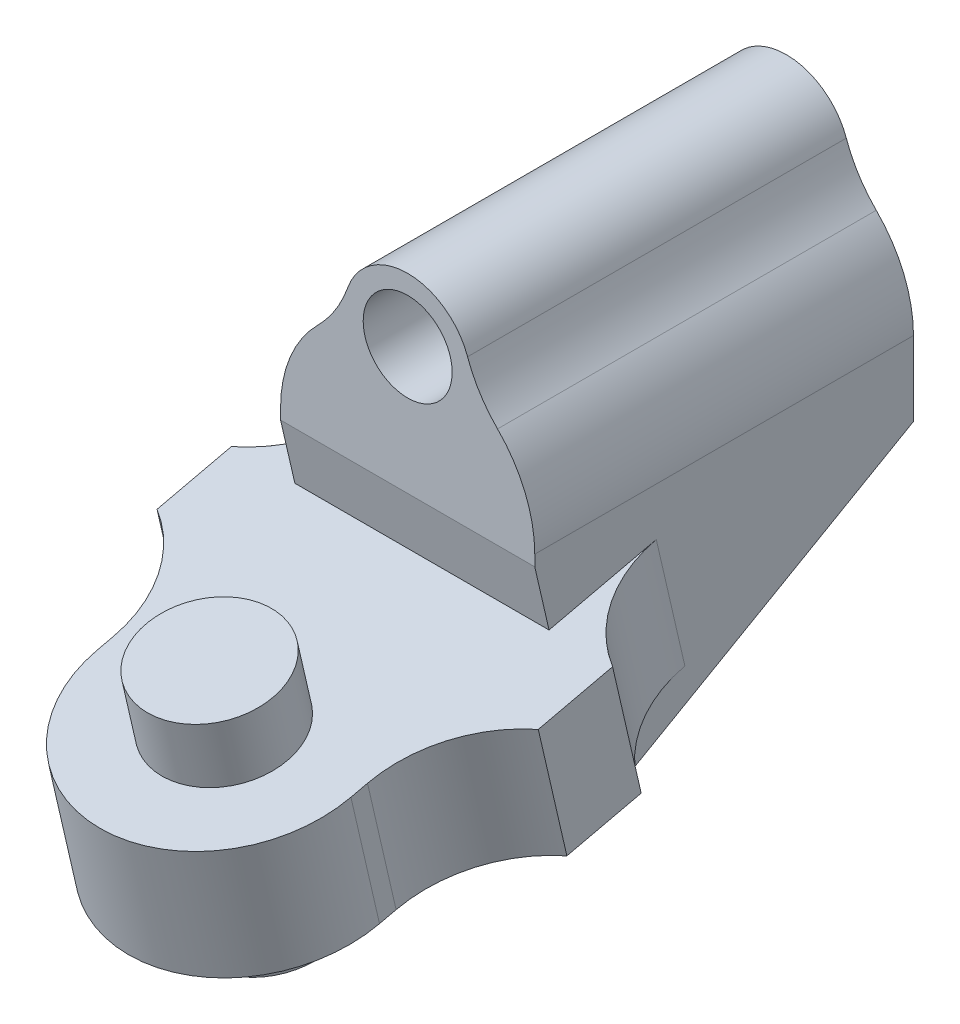
ISO-10303-21;
HEADER;
FILE_DESCRIPTION(('STEP AP214'),'2;1');
FILE_NAME('part.step','',(''),(''),'','','');
FILE_SCHEMA(('AUTOMOTIVE_DESIGN { 1 0 10303 214 1 1 1 1 }'));
ENDSEC;
DATA;
#1=APPLICATION_CONTEXT('core data for automotive mechanical design processes');
#2=APPLICATION_PROTOCOL_DEFINITION('international standard','automotive_design',2000,#1);
#3=PRODUCT_CONTEXT('',#1,'mechanical');
#4=PRODUCT('Part','Part','',(#3));
#5=PRODUCT_RELATED_PRODUCT_CATEGORY('part','',(#4));
#6=PRODUCT_DEFINITION_FORMATION('','',#4);
#7=PRODUCT_DEFINITION_CONTEXT('part definition',#1,'design');
#8=PRODUCT_DEFINITION('design','',#6,#7);
#9=PRODUCT_DEFINITION_SHAPE('','',#8);
#10=(LENGTH_UNIT() NAMED_UNIT(*) SI_UNIT(.MILLI.,.METRE.));
#11=(NAMED_UNIT(*) PLANE_ANGLE_UNIT() SI_UNIT($,.RADIAN.));
#12=(NAMED_UNIT(*) SI_UNIT($,.STERADIAN.) SOLID_ANGLE_UNIT());
#13=UNCERTAINTY_MEASURE_WITH_UNIT(LENGTH_MEASURE(1.E-05),#10,'distance_accuracy_value','');
#14=(GEOMETRIC_REPRESENTATION_CONTEXT(3) GLOBAL_UNCERTAINTY_ASSIGNED_CONTEXT((#13)) GLOBAL_UNIT_ASSIGNED_CONTEXT((#10,
#11,#12)) REPRESENTATION_CONTEXT('',''));
#15=CARTESIAN_POINT('',(0.,0.,0.));
#16=DIRECTION('',(0.,0.,1.));
#17=DIRECTION('',(1.,0.,0.));
#18=AXIS2_PLACEMENT_3D('',#15,#16,#17);
#19=CARTESIAN_POINT('',(0.,-2.5,14.9));
#20=DIRECTION('',(1.,0.,0.));
#21=DIRECTION('',(0.,0.,-1.));
#22=AXIS2_PLACEMENT_3D('',#19,#20,#21);
#23=PLANE('',#22);
#24=DIRECTION('',(0.,-0.224951054343865,0.974370064785235));
#25=VECTOR('',#24,1.);
#26=CARTESIAN_POINT('',(0.,-7.30941771983705,13.789658430654));
#27=LINE('',#26,#25);
#28=CARTESIAN_POINT('',(0.,-6.46185852361369,10.1184762201848));
#29=VERTEX_POINT('',#28);
#30=CARTESIAN_POINT('',(0.,-7.43592516196309,14.3376223641403));
#31=VERTEX_POINT('',#30);
#32=EDGE_CURVE('E201',#29,#31,#27,.T.);
#33=ORIENTED_EDGE('',*,*,#32,.T.);
#34=DIRECTION('',(0.,0.974370064785236,0.224951054343862));
#35=VECTOR('',#34,1.);
#36=CARTESIAN_POINT('',(0.,-5.,14.9));
#37=LINE('',#36,#35);
#38=CARTESIAN_POINT('',(0.,-5.,14.9));
#39=VERTEX_POINT('',#38);
#40=EDGE_CURVE('E77',#39,#31,#37,.F.);
#41=ORIENTED_EDGE('',*,*,#40,.F.);
#42=DIRECTION('',(0.,-1.,0.));
#43=VECTOR('',#42,1.);
#44=CARTESIAN_POINT('',(0.,-5.,14.9));
#45=LINE('',#44,#43);
#46=CARTESIAN_POINT('',(0.,-4.57106781186548,14.9));
#47=VERTEX_POINT('',#46);
#48=EDGE_CURVE('E556',#47,#39,#45,.T.);
#49=ORIENTED_EDGE('',*,*,#48,.F.);
#50=DIRECTION('',(0.,0.,-1.));
#51=VECTOR('',#50,1.);
#52=CARTESIAN_POINT('',(0.,-4.57106781186548,0.));
#53=LINE('',#52,#51);
#54=CARTESIAN_POINT('',(0.,-4.57106781186548,0.));
#55=VERTEX_POINT('',#54);
#56=EDGE_CURVE('E216',#47,#55,#53,.T.);
#57=ORIENTED_EDGE('',*,*,#56,.T.);
#58=DIRECTION('',(0.,-1.,0.));
#59=VECTOR('',#58,1.);
#60=CARTESIAN_POINT('',(0.,-2.5,0.));
#61=LINE('',#60,#59);
#62=CARTESIAN_POINT('',(0.,-7.5,0.));
#63=VERTEX_POINT('',#62);
#64=EDGE_CURVE('E292',#55,#63,#61,.T.);
#65=ORIENTED_EDGE('',*,*,#64,.T.);
#66=DIRECTION('',(0.,-0.49690665328333,0.867803997411144));
#67=VECTOR('',#66,1.);
#68=CARTESIAN_POINT('',(0.,-11.1218503239262,6.32524472828067));
#69=LINE('',#68,#67);
#70=CARTESIAN_POINT('',(0.,-14.7437006478523,12.6504894565614));
#71=VERTEX_POINT('',#70);
#72=EDGE_CURVE('E271',#63,#71,#69,.T.);
#73=ORIENTED_EDGE('',*,*,#72,.T.);
#74=DIRECTION('',(0.,-0.974370064785235,-0.224951054343865));
#75=VECTOR('',#74,1.);
#76=CARTESIAN_POINT('',(0.,-9.87185032392617,13.7752447282807));
#77=LINE('',#76,#75);
#78=CARTESIAN_POINT('',(0.,-12.3077754858893,13.212867092421));
#79=VERTEX_POINT('',#78);
#80=EDGE_CURVE('E66',#79,#71,#77,.T.);
#81=ORIENTED_EDGE('',*,*,#80,.F.);
#82=DIRECTION('',(0.,0.224951054343865,-0.974370064785235));
#83=VECTOR('',#82,1.);
#84=CARTESIAN_POINT('',(0.,-12.9826286489209,16.1359772867767));
#85=LINE('',#84,#83);
#86=CARTESIAN_POINT('',(0.,-11.3337088475399,8.9937209484655));
#87=VERTEX_POINT('',#86);
#88=EDGE_CURVE('E203',#79,#87,#85,.T.);
#89=ORIENTED_EDGE('',*,*,#88,.T.);
#90=DIRECTION('',(0.,0.974370064785235,0.224951054343865));
#91=VECTOR('',#90,1.);
#92=CARTESIAN_POINT('',(0.,-1.65244080377664,11.2288177895308));
#93=LINE('',#92,#91);
#94=EDGE_CURVE('E199',#87,#29,#93,.T.);
#95=ORIENTED_EDGE('',*,*,#94,.T.);
#96=EDGE_LOOP('',(#33,#41,#49,#57,#65,#73,#81,#89,#95));
#97=FACE_BOUND('',#96,.T.);
#98=ADVANCED_FACE('F48',(#97),#23,.F.);
#99=CARTESIAN_POINT('',(10.,-2.5,14.9));
#100=DIRECTION('',(1.,0.,0.));
#101=DIRECTION('',(0.,0.,-1.));
#102=AXIS2_PLACEMENT_3D('',#99,#100,#101);
#103=PLANE('',#102);
#104=DIRECTION('',(0.,0.,-1.));
#105=VECTOR('',#104,1.);
#106=CARTESIAN_POINT('',(10.,-4.57106781186548,14.9));
#107=LINE('',#106,#105);
#108=CARTESIAN_POINT('',(10.,-4.57106781186548,0.));
#109=VERTEX_POINT('',#108);
#110=CARTESIAN_POINT('',(10.,-4.57106781186548,14.9));
#111=VERTEX_POINT('',#110);
#112=EDGE_CURVE('E485',#109,#111,#107,.F.);
#113=ORIENTED_EDGE('',*,*,#112,.T.);
#114=DIRECTION('',(0.,1.,0.));
#115=VECTOR('',#114,1.);
#116=CARTESIAN_POINT('',(10.,-4.57106781186548,14.9));
#117=LINE('',#116,#115);
#118=CARTESIAN_POINT('',(10.,-5.,14.9));
#119=VERTEX_POINT('',#118);
#120=EDGE_CURVE('E549',#119,#111,#117,.T.);
#121=ORIENTED_EDGE('',*,*,#120,.F.);
#122=DIRECTION('',(0.,0.974370064785236,0.224951054343862));
#123=VECTOR('',#122,1.);
#124=CARTESIAN_POINT('',(10.,-5.,14.9));
#125=LINE('',#124,#123);
#126=CARTESIAN_POINT('',(10.,-7.43592516196309,14.3376223641403));
#127=VERTEX_POINT('',#126);
#128=EDGE_CURVE('E551',#119,#127,#125,.F.);
#129=ORIENTED_EDGE('',*,*,#128,.T.);
#130=DIRECTION('',(0.,0.224951054343865,-0.974370064785235));
#131=VECTOR('',#130,1.);
#132=CARTESIAN_POINT('',(10.,-8.11077832499468,17.260732558496));
#133=LINE('',#132,#131);
#134=CARTESIAN_POINT('',(10.,-6.46185852361368,10.1184762201848));
#135=VERTEX_POINT('',#134);
#136=EDGE_CURVE('E492',#127,#135,#133,.T.);
#137=ORIENTED_EDGE('',*,*,#136,.T.);
#138=DIRECTION('',(0.,-0.974370064785235,-0.224951054343865));
#139=VECTOR('',#138,1.);
#140=CARTESIAN_POINT('',(10.,-11.3337088475399,8.9937209484655));
#141=LINE('',#140,#139);
#142=CARTESIAN_POINT('',(10.,-11.3337088475399,8.9937209484655));
#143=VERTEX_POINT('',#142);
#144=EDGE_CURVE('E266',#135,#143,#141,.T.);
#145=ORIENTED_EDGE('',*,*,#144,.T.);
#146=DIRECTION('',(0.,-0.224951054343865,0.974370064785235));
#147=VECTOR('',#146,1.);
#148=CARTESIAN_POINT('',(10.,-12.1812680437632,12.6649031589347));
#149=LINE('',#148,#147);
#150=CARTESIAN_POINT('',(10.,-12.3077754858893,13.212867092421));
#151=VERTEX_POINT('',#150);
#152=EDGE_CURVE('E272',#143,#151,#149,.T.);
#153=ORIENTED_EDGE('',*,*,#152,.T.);
#154=DIRECTION('',(0.,-0.974370064785235,-0.224951054343865));
#155=VECTOR('',#154,1.);
#156=CARTESIAN_POINT('',(10.,-9.87185032392617,13.7752447282807));
#157=LINE('',#156,#155);
#158=CARTESIAN_POINT('',(10.,-14.7437006478523,12.6504894565614));
#159=VERTEX_POINT('',#158);
#160=EDGE_CURVE('E479',#151,#159,#157,.T.);
#161=ORIENTED_EDGE('',*,*,#160,.T.);
#162=DIRECTION('',(0.,-0.49690665328333,0.867803997411144));
#163=VECTOR('',#162,1.);
#164=CARTESIAN_POINT('',(10.,-11.1218503239262,6.32524472828067));
#165=LINE('',#164,#163);
#166=CARTESIAN_POINT('',(10.,-7.5,0.));
#167=VERTEX_POINT('',#166);
#168=EDGE_CURVE('E472',#167,#159,#165,.T.);
#169=ORIENTED_EDGE('',*,*,#168,.F.);
#170=DIRECTION('',(0.,-1.,0.));
#171=VECTOR('',#170,1.);
#172=CARTESIAN_POINT('',(10.,-2.5,0.));
#173=LINE('',#172,#171);
#174=EDGE_CURVE('E480',#109,#167,#173,.T.);
#175=ORIENTED_EDGE('',*,*,#174,.F.);
#176=EDGE_LOOP('',(#113,#121,#129,#137,#145,#153,#161,#169,#175));
#177=FACE_BOUND('',#176,.T.);
#178=ADVANCED_FACE('F431',(#177),#103,.T.);
#179=CARTESIAN_POINT('',(5.,0.,14.9));
#180=DIRECTION('',(0.,0.,-1.));
#181=DIRECTION('',(-1.,0.,0.));
#182=AXIS2_PLACEMENT_3D('',#179,#180,#181);
#183=CYLINDRICAL_SURFACE('',#182,2.5);
#184=DIRECTION('',(0.,0.,-1.));
#185=VECTOR('',#184,1.);
#186=CARTESIAN_POINT('',(2.64297739604484,0.833333333333333,14.9));
#187=LINE('',#186,#185);
#188=CARTESIAN_POINT('',(2.64297739604484,0.833333333333333,0.));
#189=VERTEX_POINT('',#188);
#190=CARTESIAN_POINT('',(2.64297739604484,0.833333333333333,14.9));
#191=VERTEX_POINT('',#190);
#192=EDGE_CURVE('E519',#189,#191,#187,.F.);
#193=ORIENTED_EDGE('',*,*,#192,.T.);
#194=CARTESIAN_POINT('',(5.,0.,14.9));
#195=DIRECTION('',(0.,0.,1.));
#196=DIRECTION('',(-1.,0.,0.));
#197=AXIS2_PLACEMENT_3D('',#194,#195,#196);
#198=CIRCLE('',#197,2.5);
#199=CARTESIAN_POINT('',(7.35702260395516,0.833333333333335,14.9));
#200=VERTEX_POINT('',#199);
#201=EDGE_CURVE('E335',#200,#191,#198,.T.);
#202=ORIENTED_EDGE('',*,*,#201,.F.);
#203=DIRECTION('',(0.,0.,-1.));
#204=VECTOR('',#203,1.);
#205=CARTESIAN_POINT('',(7.35702260395516,0.833333333333335,14.9));
#206=LINE('',#205,#204);
#207=CARTESIAN_POINT('',(7.35702260395516,0.833333333333335,0.));
#208=VERTEX_POINT('',#207);
#209=EDGE_CURVE('E522',#200,#208,#206,.T.);
#210=ORIENTED_EDGE('',*,*,#209,.T.);
#211=CARTESIAN_POINT('',(5.,0.,0.));
#212=DIRECTION('',(0.,0.,-1.));
#213=DIRECTION('',(-1.,0.,0.));
#214=AXIS2_PLACEMENT_3D('',#211,#212,#213);
#215=CIRCLE('',#214,2.5);
#216=EDGE_CURVE('E500',#189,#208,#215,.T.);
#217=ORIENTED_EDGE('',*,*,#216,.F.);
#218=EDGE_LOOP('',(#193,#202,#210,#217));
#219=FACE_BOUND('',#218,.T.);
#220=ADVANCED_FACE('F435',(#219),#183,.T.);
#221=CARTESIAN_POINT('',(-2.07106781186547,2.5,14.9));
#222=DIRECTION('',(0.,0.,-1.));
#223=DIRECTION('',(-1.,0.,0.));
#224=AXIS2_PLACEMENT_3D('',#221,#222,#223);
#225=CYLINDRICAL_SURFACE('',#224,5.);
#226=DIRECTION('',(0.,0.,1.));
#227=VECTOR('',#226,1.);
#228=CARTESIAN_POINT('',(1.46446609406726,-1.03553390593274,0.));
#229=LINE('',#228,#227);
#230=CARTESIAN_POINT('',(1.46446609406726,-1.03553390593274,14.9));
#231=VERTEX_POINT('',#230);
#232=CARTESIAN_POINT('',(1.46446609406726,-1.03553390593274,0.));
#233=VERTEX_POINT('',#232);
#234=EDGE_CURVE('E90',#231,#233,#229,.F.);
#235=ORIENTED_EDGE('',*,*,#234,.F.);
#236=CARTESIAN_POINT('',(-2.07106781186547,2.5,14.9));
#237=DIRECTION('',(0.,0.,-1.));
#238=DIRECTION('',(1.,0.,0.));
#239=AXIS2_PLACEMENT_3D('',#236,#237,#238);
#240=CIRCLE('',#239,5.);
#241=EDGE_CURVE('E561',#191,#231,#240,.T.);
#242=ORIENTED_EDGE('',*,*,#241,.F.);
#243=ORIENTED_EDGE('',*,*,#192,.F.);
#244=CARTESIAN_POINT('',(-2.07106781186547,2.5,0.));
#245=DIRECTION('',(0.,0.,1.));
#246=DIRECTION('',(1.,0.,0.));
#247=AXIS2_PLACEMENT_3D('',#244,#245,#246);
#248=CIRCLE('',#247,5.);
#249=EDGE_CURVE('E497',#233,#189,#248,.T.);
#250=ORIENTED_EDGE('',*,*,#249,.F.);
#251=EDGE_LOOP('',(#235,#242,#243,#250));
#252=FACE_BOUND('',#251,.T.);
#253=ADVANCED_FACE('F447',(#252),#225,.F.);
#254=CARTESIAN_POINT('',(5.,-4.57106781186548,14.9));
#255=DIRECTION('',(0.,0.,1.));
#256=DIRECTION('',(1.,0.,0.));
#257=AXIS2_PLACEMENT_3D('',#254,#255,#256);
#258=CYLINDRICAL_SURFACE('',#257,5.);
#259=ORIENTED_EDGE('',*,*,#56,.F.);
#260=CARTESIAN_POINT('',(5.,-4.57106781186548,14.9));
#261=DIRECTION('',(0.,0.,1.));
#262=DIRECTION('',(-1.,0.,0.));
#263=AXIS2_PLACEMENT_3D('',#260,#261,#262);
#264=CIRCLE('',#263,5.);
#265=EDGE_CURVE('E558',#231,#47,#264,.T.);
#266=ORIENTED_EDGE('',*,*,#265,.F.);
#267=ORIENTED_EDGE('',*,*,#234,.T.);
#268=CARTESIAN_POINT('',(5.,-4.57106781186548,0.));
#269=DIRECTION('',(0.,0.,1.));
#270=DIRECTION('',(1.,0.,0.));
#271=AXIS2_PLACEMENT_3D('',#268,#269,#270);
#272=CIRCLE('',#271,5.);
#273=EDGE_CURVE('E493',#55,#233,#272,.F.);
#274=ORIENTED_EDGE('',*,*,#273,.F.);
#275=EDGE_LOOP('',(#259,#266,#267,#274));
#276=FACE_BOUND('',#275,.T.);
#277=ADVANCED_FACE('F451',(#276),#258,.T.);
#278=CARTESIAN_POINT('',(12.0710678118655,2.5,14.9));
#279=DIRECTION('',(0.,0.,-1.));
#280=DIRECTION('',(-1.,0.,0.));
#281=AXIS2_PLACEMENT_3D('',#278,#279,#280);
#282=CYLINDRICAL_SURFACE('',#281,5.);
#283=ORIENTED_EDGE('',*,*,#209,.F.);
#284=CARTESIAN_POINT('',(12.0710678118655,2.5,14.9));
#285=DIRECTION('',(0.,0.,-1.));
#286=DIRECTION('',(1.,0.,0.));
#287=AXIS2_PLACEMENT_3D('',#284,#285,#286);
#288=CIRCLE('',#287,4.99999999999999);
#289=CARTESIAN_POINT('',(8.53553390593274,-1.03553390593273,14.9));
#290=VERTEX_POINT('',#289);
#291=EDGE_CURVE('E546',#290,#200,#288,.T.);
#292=ORIENTED_EDGE('',*,*,#291,.F.);
#293=DIRECTION('',(0.,0.,-1.));
#294=VECTOR('',#293,1.);
#295=CARTESIAN_POINT('',(8.53553390593273,-1.03553390593273,14.9));
#296=LINE('',#295,#294);
#297=CARTESIAN_POINT('',(8.53553390593274,-1.03553390593274,0.));
#298=VERTEX_POINT('',#297);
#299=EDGE_CURVE('E285',#298,#290,#296,.F.);
#300=ORIENTED_EDGE('',*,*,#299,.F.);
#301=CARTESIAN_POINT('',(12.0710678118655,2.5,0.));
#302=DIRECTION('',(0.,0.,1.));
#303=DIRECTION('',(1.,0.,0.));
#304=AXIS2_PLACEMENT_3D('',#301,#302,#303);
#305=CIRCLE('',#304,5.);
#306=EDGE_CURVE('E505',#208,#298,#305,.T.);
#307=ORIENTED_EDGE('',*,*,#306,.F.);
#308=EDGE_LOOP('',(#283,#292,#300,#307));
#309=FACE_BOUND('',#308,.T.);
#310=ADVANCED_FACE('F454',(#309),#282,.F.);
#311=CARTESIAN_POINT('',(5.,-4.57106781186548,14.9));
#312=DIRECTION('',(0.,0.,-1.));
#313=DIRECTION('',(-1.,0.,0.));
#314=AXIS2_PLACEMENT_3D('',#311,#312,#313);
#315=CYLINDRICAL_SURFACE('',#314,5.);
#316=ORIENTED_EDGE('',*,*,#299,.T.);
#317=CARTESIAN_POINT('',(5.,-4.57106781186548,14.9));
#318=DIRECTION('',(0.,0.,1.));
#319=DIRECTION('',(-1.,0.,0.));
#320=AXIS2_PLACEMENT_3D('',#317,#318,#319);
#321=CIRCLE('',#320,5.);
#322=EDGE_CURVE('E537',#111,#290,#321,.T.);
#323=ORIENTED_EDGE('',*,*,#322,.F.);
#324=ORIENTED_EDGE('',*,*,#112,.F.);
#325=CARTESIAN_POINT('',(5.,-4.57106781186548,0.));
#326=DIRECTION('',(0.,0.,1.));
#327=DIRECTION('',(1.,0.,0.));
#328=AXIS2_PLACEMENT_3D('',#325,#326,#327);
#329=CIRCLE('',#328,5.);
#330=EDGE_CURVE('E513',#298,#109,#329,.F.);
#331=ORIENTED_EDGE('',*,*,#330,.F.);
#332=EDGE_LOOP('',(#316,#323,#324,#331));
#333=FACE_BOUND('',#332,.T.);
#334=ADVANCED_FACE('F443',(#333),#315,.T.);
#335=CARTESIAN_POINT('',(5.,-2.5,0.));
#336=DIRECTION('',(0.,0.,1.));
#337=DIRECTION('',(1.,0.,0.));
#338=AXIS2_PLACEMENT_3D('',#335,#336,#337);
#339=PLANE('',#338);
#340=CARTESIAN_POINT('',(5.,0.,0.));
#341=DIRECTION('',(0.,0.,-1.));
#342=DIRECTION('',(-1.,0.,0.));
#343=AXIS2_PLACEMENT_3D('',#340,#341,#342);
#344=CIRCLE('',#343,1.74999999999999);
#345=CARTESIAN_POINT('',(3.25000000000001,0.,0.));
#346=VERTEX_POINT('',#345);
#347=EDGE_CURVE('E572',#346,#346,#344,.T.);
#348=ORIENTED_EDGE('',*,*,#347,.F.);
#349=EDGE_LOOP('',(#348));
#350=FACE_BOUND('',#349,.T.);
#351=ORIENTED_EDGE('',*,*,#64,.F.);
#352=ORIENTED_EDGE('',*,*,#273,.T.);
#353=ORIENTED_EDGE('',*,*,#249,.T.);
#354=ORIENTED_EDGE('',*,*,#216,.T.);
#355=ORIENTED_EDGE('',*,*,#306,.T.);
#356=ORIENTED_EDGE('',*,*,#330,.T.);
#357=ORIENTED_EDGE('',*,*,#174,.T.);
#358=DIRECTION('',(1.,0.,0.));
#359=VECTOR('',#358,1.);
#360=CARTESIAN_POINT('',(0.,-7.5,0.));
#361=LINE('',#360,#359);
#362=EDGE_CURVE('E476',#63,#167,#361,.T.);
#363=ORIENTED_EDGE('',*,*,#362,.F.);
#364=EDGE_LOOP('',(#351,#352,#353,#354,#355,#356,#357,#363));
#365=FACE_BOUND('',#364,.T.);
#366=ADVANCED_FACE('F439',(#350,#365),#339,.F.);
#367=CARTESIAN_POINT('',(0.,-9.87185032392617,13.7752447282807));
#368=DIRECTION('',(0.,-0.224951054343865,0.974370064785235));
#369=DIRECTION('',(0.,-0.974370064785235,-0.224951054343865));
#370=AXIS2_PLACEMENT_3D('',#367,#368,#369);
#371=PLANE('',#370);
#372=DIRECTION('',(1.,0.,0.));
#373=VECTOR('',#372,1.);
#374=CARTESIAN_POINT('',(5.,-12.3077754858893,13.212867092421));
#375=LINE('',#374,#373);
#376=EDGE_CURVE('E280',#79,#151,#375,.T.);
#377=ORIENTED_EDGE('',*,*,#376,.F.);
#378=ORIENTED_EDGE('',*,*,#80,.T.);
#379=DIRECTION('',(1.,0.,0.));
#380=VECTOR('',#379,1.);
#381=CARTESIAN_POINT('',(0.,-14.7437006478523,12.6504894565614));
#382=LINE('',#381,#380);
#383=EDGE_CURVE('E252',#71,#159,#382,.T.);
#384=ORIENTED_EDGE('',*,*,#383,.T.);
#385=ORIENTED_EDGE('',*,*,#160,.F.);
#386=EDGE_LOOP('',(#377,#378,#384,#385));
#387=FACE_BOUND('',#386,.T.);
#388=ADVANCED_FACE('F442',(#387),#371,.T.);
#389=CARTESIAN_POINT('',(0.,-11.1218503239262,6.32524472828067));
#390=DIRECTION('',(0.,0.867803997411144,0.49690665328333));
#391=DIRECTION('',(0.,-0.49690665328333,0.867803997411144));
#392=AXIS2_PLACEMENT_3D('',#389,#390,#391);
#393=PLANE('',#392);
#394=ORIENTED_EDGE('',*,*,#168,.T.);
#395=ORIENTED_EDGE('',*,*,#383,.F.);
#396=ORIENTED_EDGE('',*,*,#72,.F.);
#397=ORIENTED_EDGE('',*,*,#362,.T.);
#398=EDGE_LOOP('',(#394,#395,#396,#397));
#399=FACE_BOUND('',#398,.T.);
#400=ADVANCED_FACE('F427',(#399),#393,.F.);
#401=CARTESIAN_POINT('',(5.,-8.11077832499468,17.260732558496));
#402=DIRECTION('',(0.,0.974370064785235,0.224951054343865));
#403=DIRECTION('',(0.,-0.224951054343865,0.974370064785235));
#404=AXIS2_PLACEMENT_3D('',#401,#402,#403);
#405=PLANE('',#404);
#406=CARTESIAN_POINT('',(5.,-9.23553359671401,22.1325828824222));
#407=DIRECTION('',(0.,0.974370064785235,0.224951054343865));
#408=DIRECTION('',(0.,-0.224951054343865,0.974370064785235));
#409=AXIS2_PLACEMENT_3D('',#406,#407,#408);
#410=CIRCLE('',#409,2.5);
#411=CARTESIAN_POINT('',(5.,-9.79791123257367,24.5685080443853));
#412=VERTEX_POINT('',#411);
#413=EDGE_CURVE('E12',#412,#412,#410,.T.);
#414=ORIENTED_EDGE('',*,*,#413,.F.);
#415=EDGE_LOOP('',(#414));
#416=FACE_BOUND('',#415,.T.);
#417=DIRECTION('',(0.,0.224951054343865,-0.974370064785235));
#418=VECTOR('',#417,1.);
#419=CARTESIAN_POINT('',(0.,-10.3602888684333,27.0044332063484));
#420=LINE('',#419,#418);
#421=CARTESIAN_POINT('',(0.,-9.23553359671401,22.1325828824223));
#422=VERTEX_POINT('',#421);
#423=CARTESIAN_POINT('',(0.,-9.08484496334409,21.4798787024516));
#424=VERTEX_POINT('',#423);
#425=EDGE_CURVE('E247',#422,#424,#420,.T.);
#426=ORIENTED_EDGE('',*,*,#425,.F.);
#427=CARTESIAN_POINT('',(5.,-9.23553359671401,22.1325828824223));
#428=DIRECTION('',(0.,0.974370064785235,0.224951054343865));
#429=DIRECTION('',(0.,-0.224951054343865,0.974370064785235));
#430=AXIS2_PLACEMENT_3D('',#427,#428,#429);
#431=CIRCLE('',#430,5.);
#432=CARTESIAN_POINT('',(10.,-9.23553359671401,22.1325828824223));
#433=VERTEX_POINT('',#432);
#434=EDGE_CURVE('E244',#422,#433,#431,.T.);
#435=ORIENTED_EDGE('',*,*,#434,.T.);
#436=DIRECTION('',(0.,0.224951054343865,-0.974370064785235));
#437=VECTOR('',#436,1.);
#438=CARTESIAN_POINT('',(10.,-10.3602888684333,27.0044332063484));
#439=LINE('',#438,#437);
#440=CARTESIAN_POINT('',(10.,-9.08484496334409,21.4798787024516));
#441=VERTEX_POINT('',#440);
#442=EDGE_CURVE('E241',#433,#441,#439,.T.);
#443=ORIENTED_EDGE('',*,*,#442,.T.);
#444=CARTESIAN_POINT('',(15.,-9.08484496334408,21.4798787024516));
#445=DIRECTION('',(0.,0.974370064785235,0.224951054343865));
#446=DIRECTION('',(0.,-0.224951054343865,0.974370064785235));
#447=AXIS2_PLACEMENT_3D('',#444,#445,#446);
#448=CIRCLE('',#447,5.);
#449=CARTESIAN_POINT('',(12.5,-8.11077832499468,17.260732558496));
#450=VERTEX_POINT('',#449);
#451=EDGE_CURVE('E238',#441,#450,#448,.F.);
#452=ORIENTED_EDGE('',*,*,#451,.T.);
#453=DIRECTION('',(0.,0.224951054343865,-0.974370064785235));
#454=VECTOR('',#453,1.);
#455=CARTESIAN_POINT('',(12.5,-8.11077832499468,17.260732558496));
#456=LINE('',#455,#454);
#457=CARTESIAN_POINT('',(12.5,-7.43592516196309,14.3376223641403));
#458=VERTEX_POINT('',#457);
#459=EDGE_CURVE('E230',#450,#458,#456,.T.);
#460=ORIENTED_EDGE('',*,*,#459,.T.);
#461=CARTESIAN_POINT('',(15.,-6.46185852361368,10.1184762201848));
#462=DIRECTION('',(0.,0.974370064785235,0.224951054343865));
#463=DIRECTION('',(0.,-0.224951054343865,0.974370064785235));
#464=AXIS2_PLACEMENT_3D('',#461,#462,#463);
#465=CIRCLE('',#464,5.);
#466=EDGE_CURVE('E222',#458,#135,#465,.F.);
#467=ORIENTED_EDGE('',*,*,#466,.T.);
#468=ORIENTED_EDGE('',*,*,#136,.F.);
#469=DIRECTION('',(-1.,0.,0.));
#470=VECTOR('',#469,1.);
#471=CARTESIAN_POINT('',(10.,-7.43592516196308,14.3376223641403));
#472=LINE('',#471,#470);
#473=EDGE_CURVE('E58',#31,#127,#472,.F.);
#474=ORIENTED_EDGE('',*,*,#473,.F.);
#475=ORIENTED_EDGE('',*,*,#32,.F.);
#476=CARTESIAN_POINT('',(-5.,-6.46185852361369,10.1184762201848));
#477=DIRECTION('',(0.,0.974370064785235,0.224951054343865));
#478=DIRECTION('',(0.,-0.224951054343865,0.974370064785235));
#479=AXIS2_PLACEMENT_3D('',#476,#477,#478);
#480=CIRCLE('',#479,5.);
#481=CARTESIAN_POINT('',(-2.5,-7.43592516196309,14.3376223641403));
#482=VERTEX_POINT('',#481);
#483=EDGE_CURVE('E212',#29,#482,#480,.F.);
#484=ORIENTED_EDGE('',*,*,#483,.T.);
#485=DIRECTION('',(0.,0.224951054343865,-0.974370064785235));
#486=VECTOR('',#485,1.);
#487=CARTESIAN_POINT('',(-2.5,-8.11077832499469,17.260732558496));
#488=LINE('',#487,#486);
#489=CARTESIAN_POINT('',(-2.5,-8.11077832499469,17.260732558496));
#490=VERTEX_POINT('',#489);
#491=EDGE_CURVE('E223',#490,#482,#488,.T.);
#492=ORIENTED_EDGE('',*,*,#491,.F.);
#493=CARTESIAN_POINT('',(-5.,-9.08484496334409,21.4798787024516));
#494=DIRECTION('',(0.,0.974370064785235,0.224951054343865));
#495=DIRECTION('',(0.,-0.224951054343865,0.974370064785235));
#496=AXIS2_PLACEMENT_3D('',#493,#494,#495);
#497=CIRCLE('',#496,5.);
#498=EDGE_CURVE('E232',#490,#424,#497,.F.);
#499=ORIENTED_EDGE('',*,*,#498,.T.);
#500=EDGE_LOOP('',(#426,#435,#443,#452,#460,#467,#468,#474,#475,#484,#492,#499));
#501=FACE_BOUND('',#500,.T.);
#502=ADVANCED_FACE('F211',(#416,#501),#405,.T.);
#503=CARTESIAN_POINT('',(-2.5,-10.5467034869578,16.6983549226364));
#504=DIRECTION('',(1.,0.,0.));
#505=DIRECTION('',(0.,0.,-1.));
#506=AXIS2_PLACEMENT_3D('',#503,#504,#505);
#507=PLANE('',#506);
#508=DIRECTION('',(0.,-0.974370064785235,-0.224951054343865));
#509=VECTOR('',#508,1.);
#510=CARTESIAN_POINT('',(-2.5,-9.87185032392618,13.7752447282807));
#511=LINE('',#510,#509);
#512=CARTESIAN_POINT('',(-2.5,-12.3077754858893,13.212867092421));
#513=VERTEX_POINT('',#512);
#514=EDGE_CURVE('E220',#482,#513,#511,.T.);
#515=ORIENTED_EDGE('',*,*,#514,.T.);
#516=DIRECTION('',(0.,0.224951054343865,-0.974370064785235));
#517=VECTOR('',#516,1.);
#518=CARTESIAN_POINT('',(-2.5,-12.9826286489209,16.1359772867767));
#519=LINE('',#518,#517);
#520=CARTESIAN_POINT('',(-2.5,-12.9826286489209,16.1359772867767));
#521=VERTEX_POINT('',#520);
#522=EDGE_CURVE('E371',#521,#513,#519,.T.);
#523=ORIENTED_EDGE('',*,*,#522,.F.);
#524=DIRECTION('',(0.,-0.974370064785235,-0.224951054343865));
#525=VECTOR('',#524,1.);
#526=CARTESIAN_POINT('',(-2.5,-10.5467034869578,16.6983549226364));
#527=LINE('',#526,#525);
#528=EDGE_CURVE('E391',#490,#521,#527,.T.);
#529=ORIENTED_EDGE('',*,*,#528,.F.);
#530=ORIENTED_EDGE('',*,*,#491,.T.);
#531=EDGE_LOOP('',(#515,#523,#529,#530));
#532=FACE_BOUND('',#531,.T.);
#533=ADVANCED_FACE('F417',(#532),#507,.F.);
#534=CARTESIAN_POINT('',(5.,-12.9826286489209,16.1359772867767));
#535=DIRECTION('',(0.,0.974370064785235,0.224951054343865));
#536=DIRECTION('',(0.,-0.224951054343865,0.974370064785235));
#537=AXIS2_PLACEMENT_3D('',#534,#535,#536);
#538=PLANE('',#537);
#539=CARTESIAN_POINT('',(5.,-14.1073839206402,21.0078276107029));
#540=DIRECTION('',(0.,0.974370064785235,0.224951054343865));
#541=DIRECTION('',(0.,-0.224951054343865,0.974370064785235));
#542=AXIS2_PLACEMENT_3D('',#539,#540,#541);
#543=CIRCLE('',#542,2.5);
#544=CARTESIAN_POINT('',(5.,-14.6697615564999,23.443752772666));
#545=VERTEX_POINT('',#544);
#546=EDGE_CURVE('E569',#545,#545,#543,.T.);
#547=ORIENTED_EDGE('',*,*,#546,.T.);
#548=EDGE_LOOP('',(#547));
#549=FACE_BOUND('',#548,.T.);
#550=CARTESIAN_POINT('',(5.,-14.1073839206402,21.0078276107029));
#551=DIRECTION('',(0.,0.974370064785235,0.224951054343865));
#552=DIRECTION('',(0.,-0.224951054343865,0.974370064785235));
#553=AXIS2_PLACEMENT_3D('',#550,#551,#552);
#554=CIRCLE('',#553,5.);
#555=CARTESIAN_POINT('',(10.,-14.1073839206402,21.0078276107029));
#556=VERTEX_POINT('',#555);
#557=CARTESIAN_POINT('',(0.,-14.1073839206402,21.0078276107029));
#558=VERTEX_POINT('',#557);
#559=EDGE_CURVE('E402',#556,#558,#554,.F.);
#560=ORIENTED_EDGE('',*,*,#559,.T.);
#561=DIRECTION('',(0.,0.224951054343865,-0.974370064785235));
#562=VECTOR('',#561,1.);
#563=CARTESIAN_POINT('',(0.,-15.2321391923595,25.8796779346291));
#564=LINE('',#563,#562);
#565=CARTESIAN_POINT('',(0.,-13.9566952872703,20.3551234307323));
#566=VERTEX_POINT('',#565);
#567=EDGE_CURVE('E395',#558,#566,#564,.T.);
#568=ORIENTED_EDGE('',*,*,#567,.T.);
#569=CARTESIAN_POINT('',(-5.,-13.9566952872703,20.3551234307323));
#570=DIRECTION('',(0.,0.974370064785235,0.224951054343865));
#571=DIRECTION('',(0.,-0.224951054343865,0.974370064785235));
#572=AXIS2_PLACEMENT_3D('',#569,#570,#571);
#573=CIRCLE('',#572,5.);
#574=EDGE_CURVE('E390',#566,#521,#573,.T.);
#575=ORIENTED_EDGE('',*,*,#574,.T.);
#576=ORIENTED_EDGE('',*,*,#522,.T.);
#577=CARTESIAN_POINT('',(-5.,-11.3337088475399,8.9937209484655));
#578=DIRECTION('',(0.,0.974370064785235,0.224951054343865));
#579=DIRECTION('',(0.,-0.224951054343865,0.974370064785235));
#580=AXIS2_PLACEMENT_3D('',#577,#578,#579);
#581=CIRCLE('',#580,5.);
#582=EDGE_CURVE('E396',#513,#87,#581,.T.);
#583=ORIENTED_EDGE('',*,*,#582,.T.);
#584=ORIENTED_EDGE('',*,*,#88,.F.);
#585=ORIENTED_EDGE('',*,*,#376,.T.);
#586=ORIENTED_EDGE('',*,*,#152,.F.);
#587=CARTESIAN_POINT('',(15.,-11.3337088475399,8.9937209484655));
#588=DIRECTION('',(0.,0.974370064785235,0.224951054343865));
#589=DIRECTION('',(0.,-0.224951054343865,0.974370064785235));
#590=AXIS2_PLACEMENT_3D('',#587,#588,#589);
#591=CIRCLE('',#590,5.);
#592=CARTESIAN_POINT('',(12.5,-12.3077754858893,13.212867092421));
#593=VERTEX_POINT('',#592);
#594=EDGE_CURVE('E404',#143,#593,#591,.T.);
#595=ORIENTED_EDGE('',*,*,#594,.T.);
#596=DIRECTION('',(0.,0.224951054343865,-0.974370064785235));
#597=VECTOR('',#596,1.);
#598=CARTESIAN_POINT('',(12.5,-12.9826286489209,16.1359772867768));
#599=LINE('',#598,#597);
#600=CARTESIAN_POINT('',(12.5,-12.9826286489209,16.1359772867768));
#601=VERTEX_POINT('',#600);
#602=EDGE_CURVE('E624',#601,#593,#599,.T.);
#603=ORIENTED_EDGE('',*,*,#602,.F.);
#604=CARTESIAN_POINT('',(15.,-13.9566952872703,20.3551234307323));
#605=DIRECTION('',(0.,0.974370064785235,0.224951054343865));
#606=DIRECTION('',(0.,-0.224951054343865,0.974370064785235));
#607=AXIS2_PLACEMENT_3D('',#604,#605,#606);
#608=CIRCLE('',#607,5.);
#609=CARTESIAN_POINT('',(10.,-13.9566952872703,20.3551234307323));
#610=VERTEX_POINT('',#609);
#611=EDGE_CURVE('E631',#601,#610,#608,.T.);
#612=ORIENTED_EDGE('',*,*,#611,.T.);
#613=DIRECTION('',(0.,0.224951054343865,-0.974370064785235));
#614=VECTOR('',#613,1.);
#615=CARTESIAN_POINT('',(10.,-15.2321391923595,25.8796779346291));
#616=LINE('',#615,#614);
#617=EDGE_CURVE('E358',#556,#610,#616,.T.);
#618=ORIENTED_EDGE('',*,*,#617,.F.);
#619=EDGE_LOOP('',(#560,#568,#575,#576,#583,#584,#585,#586,#595,#603,#612,#618));
#620=FACE_BOUND('',#619,.T.);
#621=ADVANCED_FACE('F415',(#549,#620),#538,.F.);
#622=CARTESIAN_POINT('',(12.5,-10.5467034869578,16.6983549226364));
#623=DIRECTION('',(1.,0.,0.));
#624=DIRECTION('',(0.,0.,-1.));
#625=AXIS2_PLACEMENT_3D('',#622,#623,#624);
#626=PLANE('',#625);
#627=DIRECTION('',(0.,-0.974370064785235,-0.224951054343865));
#628=VECTOR('',#627,1.);
#629=CARTESIAN_POINT('',(12.5,-9.87185032392618,13.7752447282807));
#630=LINE('',#629,#628);
#631=EDGE_CURVE('E353',#458,#593,#630,.T.);
#632=ORIENTED_EDGE('',*,*,#631,.F.);
#633=ORIENTED_EDGE('',*,*,#459,.F.);
#634=DIRECTION('',(0.,-0.974370064785235,-0.224951054343865));
#635=VECTOR('',#634,1.);
#636=CARTESIAN_POINT('',(12.5,-10.5467034869578,16.6983549226364));
#637=LINE('',#636,#635);
#638=EDGE_CURVE('E349',#450,#601,#637,.T.);
#639=ORIENTED_EDGE('',*,*,#638,.T.);
#640=ORIENTED_EDGE('',*,*,#602,.T.);
#641=EDGE_LOOP('',(#632,#633,#639,#640));
#642=FACE_BOUND('',#641,.T.);
#643=ADVANCED_FACE('F424',(#642),#626,.T.);
#644=CARTESIAN_POINT('',(-5.,-8.89778368557677,9.55609858432517));
#645=DIRECTION('',(0.,0.974370064785235,0.224951054343865));
#646=DIRECTION('',(0.,-0.224951054343865,0.974370064785235));
#647=AXIS2_PLACEMENT_3D('',#644,#645,#646);
#648=CYLINDRICAL_SURFACE('',#647,5.);
#649=ORIENTED_EDGE('',*,*,#483,.F.);
#650=ORIENTED_EDGE('',*,*,#94,.F.);
#651=ORIENTED_EDGE('',*,*,#582,.F.);
#652=ORIENTED_EDGE('',*,*,#514,.F.);
#653=EDGE_LOOP('',(#649,#650,#651,#652));
#654=FACE_BOUND('',#653,.T.);
#655=ADVANCED_FACE('F219',(#654),#648,.F.);
#656=CARTESIAN_POINT('',(15.,-8.89778368557677,9.55609858432516));
#657=DIRECTION('',(0.,0.974370064785235,0.224951054343865));
#658=DIRECTION('',(0.,-0.224951054343865,0.974370064785235));
#659=AXIS2_PLACEMENT_3D('',#656,#657,#658);
#660=CYLINDRICAL_SURFACE('',#659,5.);
#661=ORIENTED_EDGE('',*,*,#466,.F.);
#662=ORIENTED_EDGE('',*,*,#631,.T.);
#663=ORIENTED_EDGE('',*,*,#594,.F.);
#664=ORIENTED_EDGE('',*,*,#144,.F.);
#665=EDGE_LOOP('',(#661,#662,#663,#664));
#666=FACE_BOUND('',#665,.T.);
#667=ADVANCED_FACE('F609',(#666),#660,.F.);
#668=CARTESIAN_POINT('',(0.,-12.7962140303964,26.4420555704887));
#669=DIRECTION('',(1.,0.,0.));
#670=DIRECTION('',(0.,0.,-1.));
#671=AXIS2_PLACEMENT_3D('',#668,#669,#670);
#672=PLANE('',#671);
#673=ORIENTED_EDGE('',*,*,#425,.T.);
#674=DIRECTION('',(0.,0.974370064785235,0.224951054343865));
#675=VECTOR('',#674,1.);
#676=CARTESIAN_POINT('',(0.,-11.5207701253072,20.9175010665919));
#677=LINE('',#676,#675);
#678=EDGE_CURVE('E345',#424,#566,#677,.F.);
#679=ORIENTED_EDGE('',*,*,#678,.T.);
#680=ORIENTED_EDGE('',*,*,#567,.F.);
#681=DIRECTION('',(0.,-0.974370064785235,-0.224951054343865));
#682=VECTOR('',#681,1.);
#683=CARTESIAN_POINT('',(0.,-9.23553359671401,22.1325828824223));
#684=LINE('',#683,#682);
#685=EDGE_CURVE('E341',#558,#422,#684,.F.);
#686=ORIENTED_EDGE('',*,*,#685,.T.);
#687=EDGE_LOOP('',(#673,#679,#680,#686));
#688=FACE_BOUND('',#687,.T.);
#689=ADVANCED_FACE('F383',(#688),#672,.F.);
#690=CARTESIAN_POINT('',(10.,-12.7962140303964,26.4420555704887));
#691=DIRECTION('',(1.,0.,0.));
#692=DIRECTION('',(0.,0.,-1.));
#693=AXIS2_PLACEMENT_3D('',#690,#691,#692);
#694=PLANE('',#693);
#695=ORIENTED_EDGE('',*,*,#617,.T.);
#696=DIRECTION('',(0.,-0.974370064785235,-0.224951054343865));
#697=VECTOR('',#696,1.);
#698=CARTESIAN_POINT('',(10.,-9.08484496334408,21.4798787024516));
#699=LINE('',#698,#697);
#700=EDGE_CURVE('E334',#610,#441,#699,.F.);
#701=ORIENTED_EDGE('',*,*,#700,.T.);
#702=ORIENTED_EDGE('',*,*,#442,.F.);
#703=DIRECTION('',(0.,-0.974370064785235,-0.224951054343865));
#704=VECTOR('',#703,1.);
#705=CARTESIAN_POINT('',(10.,-11.6714587586771,21.5702052465626));
#706=LINE('',#705,#704);
#707=EDGE_CURVE('E328',#433,#556,#706,.T.);
#708=ORIENTED_EDGE('',*,*,#707,.T.);
#709=EDGE_LOOP('',(#695,#701,#702,#708));
#710=FACE_BOUND('',#709,.T.);
#711=ADVANCED_FACE('F603',(#710),#694,.T.);
#712=CARTESIAN_POINT('',(-5.,-11.5207701253072,20.9175010665919));
#713=DIRECTION('',(0.,0.974370064785235,0.224951054343865));
#714=DIRECTION('',(0.,-0.224951054343865,0.974370064785235));
#715=AXIS2_PLACEMENT_3D('',#712,#713,#714);
#716=CYLINDRICAL_SURFACE('',#715,5.);
#717=ORIENTED_EDGE('',*,*,#498,.F.);
#718=ORIENTED_EDGE('',*,*,#528,.T.);
#719=ORIENTED_EDGE('',*,*,#574,.F.);
#720=ORIENTED_EDGE('',*,*,#678,.F.);
#721=EDGE_LOOP('',(#717,#718,#719,#720));
#722=FACE_BOUND('',#721,.T.);
#723=ADVANCED_FACE('F388',(#722),#716,.F.);
#724=CARTESIAN_POINT('',(15.,-11.5207701253072,20.9175010665919));
#725=DIRECTION('',(0.,0.974370064785235,0.224951054343865));
#726=DIRECTION('',(0.,-0.224951054343865,0.974370064785235));
#727=AXIS2_PLACEMENT_3D('',#724,#725,#726);
#728=CYLINDRICAL_SURFACE('',#727,5.);
#729=ORIENTED_EDGE('',*,*,#451,.F.);
#730=ORIENTED_EDGE('',*,*,#700,.F.);
#731=ORIENTED_EDGE('',*,*,#611,.F.);
#732=ORIENTED_EDGE('',*,*,#638,.F.);
#733=EDGE_LOOP('',(#729,#730,#731,#732));
#734=FACE_BOUND('',#733,.T.);
#735=ADVANCED_FACE('F596',(#734),#728,.F.);
#736=CARTESIAN_POINT('',(5.,-11.6714587586771,21.5702052465626));
#737=DIRECTION('',(0.,-0.974370064785235,-0.224951054343865));
#738=DIRECTION('',(0.,0.224951054343865,-0.974370064785235));
#739=AXIS2_PLACEMENT_3D('',#736,#737,#738);
#740=CYLINDRICAL_SURFACE('',#739,5.);
#741=ORIENTED_EDGE('',*,*,#707,.F.);
#742=ORIENTED_EDGE('',*,*,#434,.F.);
#743=ORIENTED_EDGE('',*,*,#685,.F.);
#744=ORIENTED_EDGE('',*,*,#559,.F.);
#745=EDGE_LOOP('',(#741,#742,#743,#744));
#746=FACE_BOUND('',#745,.T.);
#747=ADVANCED_FACE('F591',(#746),#740,.T.);
#748=CARTESIAN_POINT('',(10.,-5.,14.9));
#749=DIRECTION('',(0.,-0.224951054343862,0.974370064785236));
#750=DIRECTION('',(0.,-0.974370064785236,-0.224951054343862));
#751=AXIS2_PLACEMENT_3D('',#748,#749,#750);
#752=PLANE('',#751);
#753=ORIENTED_EDGE('',*,*,#473,.T.);
#754=ORIENTED_EDGE('',*,*,#128,.F.);
#755=DIRECTION('',(1.,0.,0.));
#756=VECTOR('',#755,1.);
#757=CARTESIAN_POINT('',(10.,-5.,14.9));
#758=LINE('',#757,#756);
#759=EDGE_CURVE('E554',#39,#119,#758,.T.);
#760=ORIENTED_EDGE('',*,*,#759,.F.);
#761=ORIENTED_EDGE('',*,*,#40,.T.);
#762=EDGE_LOOP('',(#753,#754,#760,#761));
#763=FACE_BOUND('',#762,.T.);
#764=ADVANCED_FACE('F50',(#763),#752,.T.);
#765=CARTESIAN_POINT('',(-2.07106781186547,2.5,14.9));
#766=DIRECTION('',(0.,0.,1.));
#767=DIRECTION('',(1.,0.,0.));
#768=AXIS2_PLACEMENT_3D('',#765,#766,#767);
#769=PLANE('',#768);
#770=CARTESIAN_POINT('',(5.,0.,14.9));
#771=DIRECTION('',(0.,0.,1.));
#772=DIRECTION('',(1.,0.,0.));
#773=AXIS2_PLACEMENT_3D('',#770,#771,#772);
#774=CIRCLE('',#773,1.74999999999999);
#775=CARTESIAN_POINT('',(6.74999999999999,0.,14.9));
#776=VERTEX_POINT('',#775);
#777=EDGE_CURVE('E52',#776,#776,#774,.T.);
#778=ORIENTED_EDGE('',*,*,#777,.F.);
#779=EDGE_LOOP('',(#778));
#780=FACE_BOUND('',#779,.T.);
#781=ORIENTED_EDGE('',*,*,#241,.T.);
#782=ORIENTED_EDGE('',*,*,#265,.T.);
#783=ORIENTED_EDGE('',*,*,#48,.T.);
#784=ORIENTED_EDGE('',*,*,#759,.T.);
#785=ORIENTED_EDGE('',*,*,#120,.T.);
#786=ORIENTED_EDGE('',*,*,#322,.T.);
#787=ORIENTED_EDGE('',*,*,#291,.T.);
#788=ORIENTED_EDGE('',*,*,#201,.T.);
#789=EDGE_LOOP('',(#781,#782,#783,#784,#785,#786,#787,#788));
#790=FACE_BOUND('',#789,.T.);
#791=ADVANCED_FACE('F544',(#780,#790),#769,.T.);
#792=CARTESIAN_POINT('',(5.,-9.23553359671401,22.1325828824222));
#793=DIRECTION('',(0.,0.974370064785235,0.224951054343866));
#794=DIRECTION('',(0.,-0.224951054343866,0.974370064785235));
#795=AXIS2_PLACEMENT_3D('',#792,#793,#794);
#796=CYLINDRICAL_SURFACE('',#795,2.5);
#797=ORIENTED_EDGE('',*,*,#413,.T.);
#798=EDGE_LOOP('',(#797));
#799=FACE_BOUND('',#798,.T.);
#800=CARTESIAN_POINT('',(5.,-6.79960843475093,22.6949605182819));
#801=DIRECTION('',(0.,0.974370064785235,0.224951054343866));
#802=DIRECTION('',(0.,-0.224951054343866,0.974370064785235));
#803=AXIS2_PLACEMENT_3D('',#800,#801,#802);
#804=CIRCLE('',#803,2.5);
#805=CARTESIAN_POINT('',(5.,-7.3619860706106,25.130885680245));
#806=VERTEX_POINT('',#805);
#807=EDGE_CURVE('E563',#806,#806,#804,.T.);
#808=ORIENTED_EDGE('',*,*,#807,.F.);
#809=EDGE_LOOP('',(#808));
#810=FACE_BOUND('',#809,.T.);
#811=ADVANCED_FACE('F582',(#799,#810),#796,.T.);
#812=CARTESIAN_POINT('',(5.,-6.79960843475093,22.6949605182819));
#813=DIRECTION('',(0.,0.974370064785235,0.224951054343866));
#814=DIRECTION('',(0.,-0.224951054343866,0.974370064785235));
#815=AXIS2_PLACEMENT_3D('',#812,#813,#814);
#816=PLANE('',#815);
#817=ORIENTED_EDGE('',*,*,#807,.T.);
#818=EDGE_LOOP('',(#817));
#819=FACE_BOUND('',#818,.T.);
#820=ADVANCED_FACE('F588',(#819),#816,.T.);
#821=CARTESIAN_POINT('',(5.,-16.5433090826033,20.4454499748433));
#822=DIRECTION('',(0.,0.974370064785235,0.224951054343865));
#823=DIRECTION('',(0.,-0.224951054343865,0.974370064785235));
#824=AXIS2_PLACEMENT_3D('',#821,#822,#823);
#825=CYLINDRICAL_SURFACE('',#824,2.5);
#826=CARTESIAN_POINT('',(5.,-16.5433090826033,20.4454499748433));
#827=DIRECTION('',(0.,0.974370064785235,0.224951054343865));
#828=DIRECTION('',(0.,-0.224951054343865,0.974370064785235));
#829=AXIS2_PLACEMENT_3D('',#826,#827,#828);
#830=CIRCLE('',#829,2.5);
#831=CARTESIAN_POINT('',(5.,-17.105686718463,22.8813751368063));
#832=VERTEX_POINT('',#831);
#833=EDGE_CURVE('E566',#832,#832,#830,.T.);
#834=ORIENTED_EDGE('',*,*,#833,.T.);
#835=EDGE_LOOP('',(#834));
#836=FACE_BOUND('',#835,.T.);
#837=ORIENTED_EDGE('',*,*,#546,.F.);
#838=EDGE_LOOP('',(#837));
#839=FACE_BOUND('',#838,.T.);
#840=ADVANCED_FACE('F1109',(#836,#839),#825,.T.);
#841=CARTESIAN_POINT('',(7.5,-16.5433090826033,20.4454499748433));
#842=DIRECTION('',(0.,-0.974370064785235,-0.224951054343865));
#843=DIRECTION('',(0.,0.224951054343865,-0.974370064785235));
#844=AXIS2_PLACEMENT_3D('',#841,#842,#843);
#845=PLANE('',#844);
#846=ORIENTED_EDGE('',*,*,#833,.F.);
#847=EDGE_LOOP('',(#846));
#848=FACE_BOUND('',#847,.T.);
#849=ADVANCED_FACE('F1117',(#848),#845,.T.);
#850=CARTESIAN_POINT('',(5.,0.,0.));
#851=DIRECTION('',(0.,0.,-1.));
#852=DIRECTION('',(-1.,0.,0.));
#853=AXIS2_PLACEMENT_3D('',#850,#851,#852);
#854=CYLINDRICAL_SURFACE('',#853,1.74999999999999);
#855=ORIENTED_EDGE('',*,*,#777,.T.);
#856=EDGE_LOOP('',(#855));
#857=FACE_BOUND('',#856,.T.);
#858=ORIENTED_EDGE('',*,*,#347,.T.);
#859=EDGE_LOOP('',(#858));
#860=FACE_BOUND('',#859,.T.);
#861=ADVANCED_FACE('F579',(#857,#860),#854,.F.);
#862=CLOSED_SHELL('',(#98,#178,#220,#253,#277,#310,#334,#366,#388,#400,#502,#533,#621,#643,#655,
#667,#689,#711,#723,#735,#747,#764,#791,#811,#820,#840,#849,#861));
#863=MANIFOLD_SOLID_BREP('B2',#862);
#864=ADVANCED_BREP_SHAPE_REPRESENTATION('',(#18,#863),#14);
#865=SHAPE_DEFINITION_REPRESENTATION(#9,#864);
ENDSEC;
END-ISO-10303-21;
